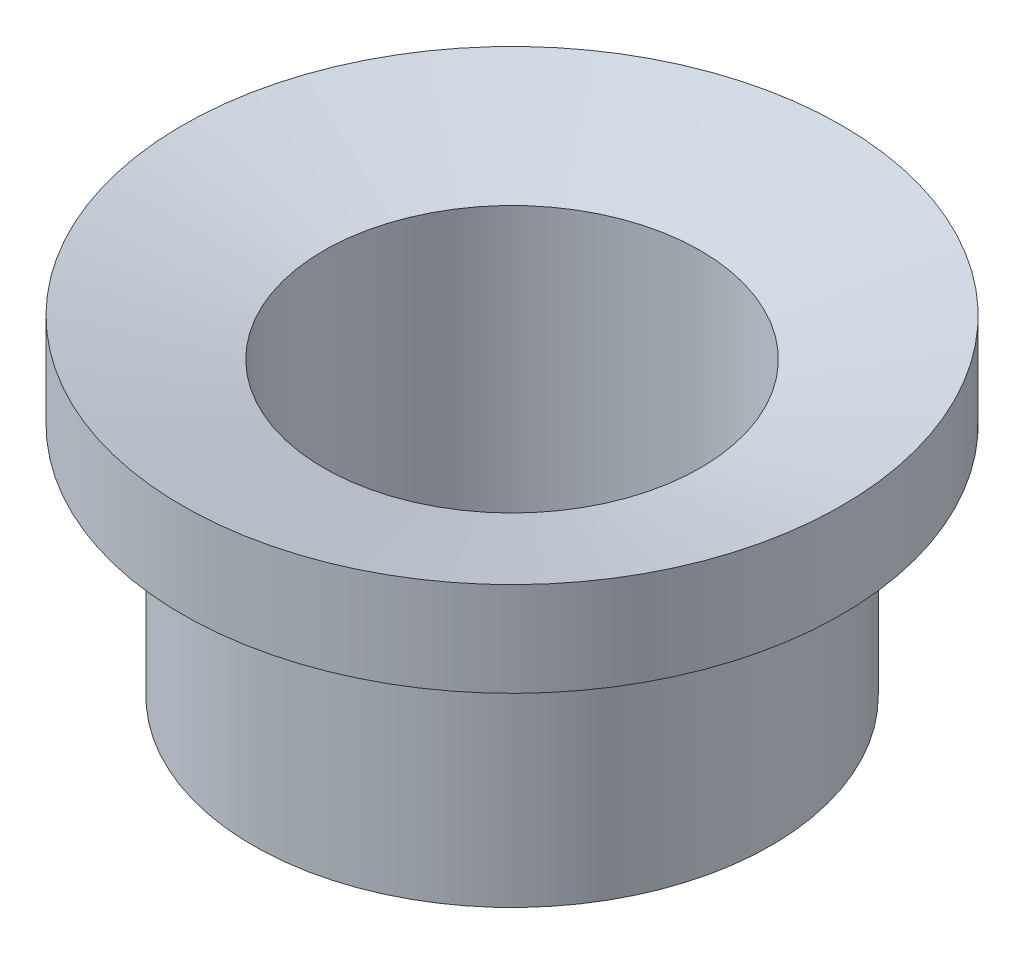
ISO-10303-21;
HEADER;
FILE_DESCRIPTION(('STEP AP214'),'2;1');
FILE_NAME('part.step','',(''),(''),'','','');
FILE_SCHEMA(('AUTOMOTIVE_DESIGN { 1 0 10303 214 1 1 1 1 }'));
ENDSEC;
DATA;
#1=APPLICATION_CONTEXT('core data for automotive mechanical design processes');
#2=APPLICATION_PROTOCOL_DEFINITION('international standard','automotive_design',2000,#1);
#3=PRODUCT_CONTEXT('',#1,'mechanical');
#4=PRODUCT('Part','Part','',(#3));
#5=PRODUCT_RELATED_PRODUCT_CATEGORY('part','',(#4));
#6=PRODUCT_DEFINITION_FORMATION('','',#4);
#7=PRODUCT_DEFINITION_CONTEXT('part definition',#1,'design');
#8=PRODUCT_DEFINITION('design','',#6,#7);
#9=PRODUCT_DEFINITION_SHAPE('','',#8);
#10=(LENGTH_UNIT() NAMED_UNIT(*) SI_UNIT(.MILLI.,.METRE.));
#11=(NAMED_UNIT(*) PLANE_ANGLE_UNIT() SI_UNIT($,.RADIAN.));
#12=(NAMED_UNIT(*) SI_UNIT($,.STERADIAN.) SOLID_ANGLE_UNIT());
#13=UNCERTAINTY_MEASURE_WITH_UNIT(LENGTH_MEASURE(1.E-05),#10,'distance_accuracy_value','');
#14=(GEOMETRIC_REPRESENTATION_CONTEXT(3) GLOBAL_UNCERTAINTY_ASSIGNED_CONTEXT((#13)) GLOBAL_UNIT_ASSIGNED_CONTEXT((#10,
#11,#12)) REPRESENTATION_CONTEXT('',''));
#15=CARTESIAN_POINT('',(0.,0.,0.));
#16=DIRECTION('',(0.,0.,1.));
#17=DIRECTION('',(1.,0.,0.));
#18=AXIS2_PLACEMENT_3D('',#15,#16,#17);
#19=CARTESIAN_POINT('',(0.,0.,0.));
#20=DIRECTION('',(0.,-1.,0.));
#21=DIRECTION('',(0.,0.,-1.));
#22=AXIS2_PLACEMENT_3D('',#19,#20,#21);
#23=CYLINDRICAL_SURFACE('',#22,12.);
#24=CARTESIAN_POINT('',(0.,0.,0.));
#25=DIRECTION('',(0.,-1.,0.));
#26=DIRECTION('',(0.,0.,-1.));
#27=AXIS2_PLACEMENT_3D('',#24,#25,#26);
#28=CIRCLE('',#27,12.);
#29=CARTESIAN_POINT('',(0.,0.,-12.));
#30=VERTEX_POINT('',#29);
#31=EDGE_CURVE('E10',#30,#30,#28,.T.);
#32=ORIENTED_EDGE('',*,*,#31,.T.);
#33=EDGE_LOOP('',(#32));
#34=FACE_BOUND('',#33,.T.);
#35=CARTESIAN_POINT('',(0.,18.5884572681199,0.));
#36=DIRECTION('',(0.,-1.,0.));
#37=DIRECTION('',(0.,0.,-1.));
#38=AXIS2_PLACEMENT_3D('',#35,#36,#37);
#39=CIRCLE('',#38,12.);
#40=CARTESIAN_POINT('',(0.,18.5884572681199,-12.));
#41=VERTEX_POINT('',#40);
#42=EDGE_CURVE('E53',#41,#41,#39,.T.);
#43=ORIENTED_EDGE('',*,*,#42,.F.);
#44=EDGE_LOOP('',(#43));
#45=FACE_BOUND('',#44,.T.);
#46=ADVANCED_FACE('F31',(#34,#45),#23,.F.);
#47=CARTESIAN_POINT('',(12.,0.,0.));
#48=DIRECTION('',(0.,-1.,0.));
#49=DIRECTION('',(0.,0.,-1.));
#50=AXIS2_PLACEMENT_3D('',#47,#48,#49);
#51=PLANE('',#50);
#52=CARTESIAN_POINT('',(0.,0.,0.));
#53=DIRECTION('',(0.,-1.,0.));
#54=DIRECTION('',(0.,0.,-1.));
#55=AXIS2_PLACEMENT_3D('',#52,#53,#54);
#56=CIRCLE('',#55,16.5);
#57=CARTESIAN_POINT('',(0.,0.,-16.5));
#58=VERTEX_POINT('',#57);
#59=EDGE_CURVE('E37',#58,#58,#56,.T.);
#60=ORIENTED_EDGE('',*,*,#59,.T.);
#61=EDGE_LOOP('',(#60));
#62=FACE_BOUND('',#61,.T.);
#63=ORIENTED_EDGE('',*,*,#31,.F.);
#64=EDGE_LOOP('',(#63));
#65=FACE_BOUND('',#64,.T.);
#66=ADVANCED_FACE('F61',(#62,#65),#51,.T.);
#67=CARTESIAN_POINT('',(0.,0.,0.));
#68=DIRECTION('',(0.,-1.,0.));
#69=DIRECTION('',(0.,0.,-1.));
#70=AXIS2_PLACEMENT_3D('',#67,#68,#69);
#71=CYLINDRICAL_SURFACE('',#70,16.5);
#72=CARTESIAN_POINT('',(0.,15.,0.));
#73=DIRECTION('',(0.,-1.,0.));
#74=DIRECTION('',(0.,0.,-1.));
#75=AXIS2_PLACEMENT_3D('',#72,#73,#74);
#76=CIRCLE('',#75,16.5);
#77=CARTESIAN_POINT('',(0.,15.,-16.5));
#78=VERTEX_POINT('',#77);
#79=EDGE_CURVE('E41',#78,#78,#76,.T.);
#80=ORIENTED_EDGE('',*,*,#79,.T.);
#81=EDGE_LOOP('',(#80));
#82=FACE_BOUND('',#81,.T.);
#83=ORIENTED_EDGE('',*,*,#59,.F.);
#84=EDGE_LOOP('',(#83));
#85=FACE_BOUND('',#84,.T.);
#86=ADVANCED_FACE('F65',(#82,#85),#71,.T.);
#87=CARTESIAN_POINT('',(16.5,15.,0.));
#88=DIRECTION('',(0.,-1.,0.));
#89=DIRECTION('',(0.,0.,-1.));
#90=AXIS2_PLACEMENT_3D('',#87,#88,#89);
#91=PLANE('',#90);
#92=CARTESIAN_POINT('',(0.,15.,0.));
#93=DIRECTION('',(0.,-1.,0.));
#94=DIRECTION('',(0.,0.,-1.));
#95=AXIS2_PLACEMENT_3D('',#92,#93,#94);
#96=CIRCLE('',#95,21.);
#97=CARTESIAN_POINT('',(0.,15.,-21.));
#98=VERTEX_POINT('',#97);
#99=EDGE_CURVE('E45',#98,#98,#96,.T.);
#100=ORIENTED_EDGE('',*,*,#99,.T.);
#101=EDGE_LOOP('',(#100));
#102=FACE_BOUND('',#101,.T.);
#103=ORIENTED_EDGE('',*,*,#79,.F.);
#104=EDGE_LOOP('',(#103));
#105=FACE_BOUND('',#104,.T.);
#106=ADVANCED_FACE('F69',(#102,#105),#91,.T.);
#107=CARTESIAN_POINT('',(0.,0.,0.));
#108=DIRECTION('',(0.,-1.,0.));
#109=DIRECTION('',(0.,0.,-1.));
#110=AXIS2_PLACEMENT_3D('',#107,#108,#109);
#111=CYLINDRICAL_SURFACE('',#110,21.);
#112=CARTESIAN_POINT('',(0.,21.,0.));
#113=DIRECTION('',(0.,-1.,0.));
#114=DIRECTION('',(0.,0.,-1.));
#115=AXIS2_PLACEMENT_3D('',#112,#113,#114);
#116=CIRCLE('',#115,21.);
#117=CARTESIAN_POINT('',(0.,21.,-21.));
#118=VERTEX_POINT('',#117);
#119=EDGE_CURVE('E50',#118,#118,#116,.T.);
#120=ORIENTED_EDGE('',*,*,#119,.T.);
#121=EDGE_LOOP('',(#120));
#122=FACE_BOUND('',#121,.T.);
#123=ORIENTED_EDGE('',*,*,#99,.F.);
#124=EDGE_LOOP('',(#123));
#125=FACE_BOUND('',#124,.T.);
#126=ADVANCED_FACE('F76',(#122,#125),#111,.T.);
#127=CARTESIAN_POINT('',(0.,21.,0.));
#128=DIRECTION('',(0.,1.,0.));
#129=DIRECTION('',(0.,0.,1.));
#130=AXIS2_PLACEMENT_3D('',#127,#128,#129);
#131=CONICAL_SURFACE('',#130,21.,1.30899693899575);
#132=ORIENTED_EDGE('',*,*,#42,.T.);
#133=EDGE_LOOP('',(#132));
#134=FACE_BOUND('',#133,.T.);
#135=ORIENTED_EDGE('',*,*,#119,.F.);
#136=EDGE_LOOP('',(#135));
#137=FACE_BOUND('',#136,.T.);
#138=ADVANCED_FACE('F57',(#134,#137),#131,.F.);
#139=CLOSED_SHELL('',(#46,#66,#86,#106,#126,#138));
#140=MANIFOLD_SOLID_BREP('B2',#139);
#141=ADVANCED_BREP_SHAPE_REPRESENTATION('',(#18,#140),#14);
#142=SHAPE_DEFINITION_REPRESENTATION(#9,#141);
ENDSEC;
END-ISO-10303-21;
